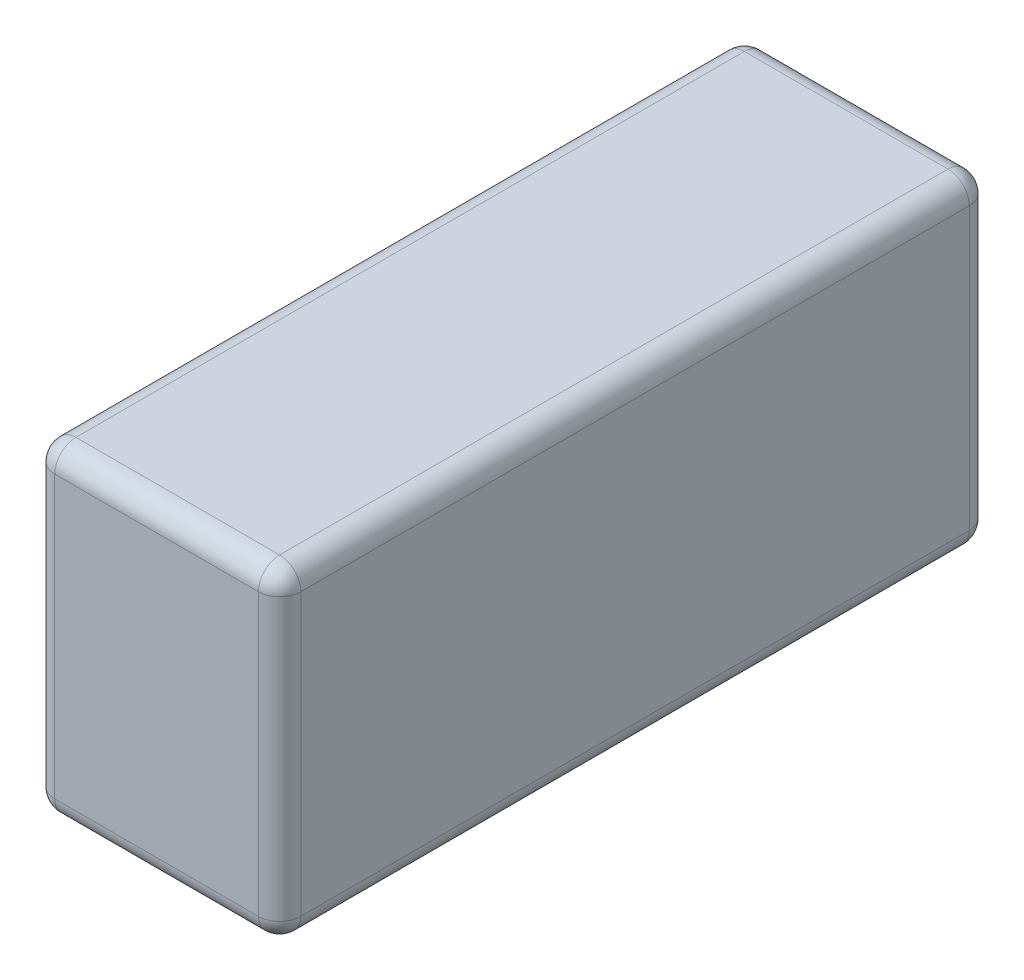
ISO-10303-21;
HEADER;
FILE_DESCRIPTION(('STEP AP214'),'2;1');
FILE_NAME('part.step','',(''),(''),'','','');
FILE_SCHEMA(('AUTOMOTIVE_DESIGN { 1 0 10303 214 1 1 1 1 }'));
ENDSEC;
DATA;
#1=APPLICATION_CONTEXT('core data for automotive mechanical design processes');
#2=APPLICATION_PROTOCOL_DEFINITION('international standard','automotive_design',2000,#1);
#3=PRODUCT_CONTEXT('',#1,'mechanical');
#4=PRODUCT('Part','Part','',(#3));
#5=PRODUCT_RELATED_PRODUCT_CATEGORY('part','',(#4));
#6=PRODUCT_DEFINITION_FORMATION('','',#4);
#7=PRODUCT_DEFINITION_CONTEXT('part definition',#1,'design');
#8=PRODUCT_DEFINITION('design','',#6,#7);
#9=PRODUCT_DEFINITION_SHAPE('','',#8);
#10=(LENGTH_UNIT() NAMED_UNIT(*) SI_UNIT(.MILLI.,.METRE.));
#11=(NAMED_UNIT(*) PLANE_ANGLE_UNIT() SI_UNIT($,.RADIAN.));
#12=(NAMED_UNIT(*) SI_UNIT($,.STERADIAN.) SOLID_ANGLE_UNIT());
#13=UNCERTAINTY_MEASURE_WITH_UNIT(LENGTH_MEASURE(1.E-05),#10,'distance_accuracy_value','');
#14=(GEOMETRIC_REPRESENTATION_CONTEXT(3) GLOBAL_UNCERTAINTY_ASSIGNED_CONTEXT((#13)) GLOBAL_UNIT_ASSIGNED_CONTEXT((#10,
#11,#12)) REPRESENTATION_CONTEXT('',''));
#15=CARTESIAN_POINT('',(0.,0.,0.));
#16=DIRECTION('',(0.,0.,1.));
#17=DIRECTION('',(1.,0.,0.));
#18=AXIS2_PLACEMENT_3D('',#15,#16,#17);
#19=CARTESIAN_POINT('',(11.6,30.5,-33.5));
#20=DIRECTION('',(-1.,0.,0.));
#21=DIRECTION('',(0.,0.,1.));
#22=AXIS2_PLACEMENT_3D('',#19,#20,#21);
#23=PLANE('',#22);
#24=DIRECTION('',(0.,-1.,0.));
#25=VECTOR('',#24,1.);
#26=CARTESIAN_POINT('',(11.6,30.5,-31.5));
#27=LINE('',#26,#25);
#28=CARTESIAN_POINT('',(11.6,2.,-31.5));
#29=VERTEX_POINT('',#28);
#30=CARTESIAN_POINT('',(11.6,28.5,-31.5));
#31=VERTEX_POINT('',#30);
#32=EDGE_CURVE('E218',#29,#31,#27,.F.);
#33=ORIENTED_EDGE('',*,*,#32,.T.);
#34=DIRECTION('',(0.,0.,-1.));
#35=VECTOR('',#34,1.);
#36=CARTESIAN_POINT('',(11.6,28.5,33.5));
#37=LINE('',#36,#35);
#38=CARTESIAN_POINT('',(11.6,28.5,31.5));
#39=VERTEX_POINT('',#38);
#40=EDGE_CURVE('E221',#31,#39,#37,.F.);
#41=ORIENTED_EDGE('',*,*,#40,.T.);
#42=DIRECTION('',(0.,-1.,0.));
#43=VECTOR('',#42,1.);
#44=CARTESIAN_POINT('',(11.6,30.5,31.5));
#45=LINE('',#44,#43);
#46=CARTESIAN_POINT('',(11.6,2.,31.5));
#47=VERTEX_POINT('',#46);
#48=EDGE_CURVE('E219',#39,#47,#45,.T.);
#49=ORIENTED_EDGE('',*,*,#48,.T.);
#50=DIRECTION('',(0.,0.,-1.));
#51=VECTOR('',#50,1.);
#52=CARTESIAN_POINT('',(11.6,2.,-33.5));
#53=LINE('',#52,#51);
#54=EDGE_CURVE('E215',#47,#29,#53,.T.);
#55=ORIENTED_EDGE('',*,*,#54,.T.);
#56=EDGE_LOOP('',(#33,#41,#49,#55));
#57=FACE_BOUND('',#56,.T.);
#58=ADVANCED_FACE('F36',(#57),#23,.F.);
#59=CARTESIAN_POINT('',(-11.6,30.5,-33.5));
#60=DIRECTION('',(0.,0.,1.));
#61=DIRECTION('',(1.,0.,0.));
#62=AXIS2_PLACEMENT_3D('',#59,#60,#61);
#63=PLANE('',#62);
#64=DIRECTION('',(-1.,0.,0.));
#65=VECTOR('',#64,1.);
#66=CARTESIAN_POINT('',(-11.6,2.,-33.5));
#67=LINE('',#66,#65);
#68=CARTESIAN_POINT('',(9.59999999999999,2.,-33.5));
#69=VERTEX_POINT('',#68);
#70=CARTESIAN_POINT('',(-9.6,2.,-33.5));
#71=VERTEX_POINT('',#70);
#72=EDGE_CURVE('E259',#69,#71,#67,.T.);
#73=ORIENTED_EDGE('',*,*,#72,.T.);
#74=DIRECTION('',(0.,-1.,0.));
#75=VECTOR('',#74,1.);
#76=CARTESIAN_POINT('',(-9.6,30.5,-33.5));
#77=LINE('',#76,#75);
#78=CARTESIAN_POINT('',(-9.6,28.5,-33.5));
#79=VERTEX_POINT('',#78);
#80=EDGE_CURVE('E265',#71,#79,#77,.F.);
#81=ORIENTED_EDGE('',*,*,#80,.T.);
#82=DIRECTION('',(-1.,0.,0.));
#83=VECTOR('',#82,1.);
#84=CARTESIAN_POINT('',(11.6,28.5,-33.5));
#85=LINE('',#84,#83);
#86=CARTESIAN_POINT('',(9.59999999999999,28.5,-33.5));
#87=VERTEX_POINT('',#86);
#88=EDGE_CURVE('E262',#79,#87,#85,.F.);
#89=ORIENTED_EDGE('',*,*,#88,.T.);
#90=DIRECTION('',(0.,-1.,0.));
#91=VECTOR('',#90,1.);
#92=CARTESIAN_POINT('',(9.59999999999999,30.5,-33.5));
#93=LINE('',#92,#91);
#94=EDGE_CURVE('E254',#87,#69,#93,.T.);
#95=ORIENTED_EDGE('',*,*,#94,.T.);
#96=EDGE_LOOP('',(#73,#81,#89,#95));
#97=FACE_BOUND('',#96,.T.);
#98=ADVANCED_FACE('F263',(#97),#63,.F.);
#99=CARTESIAN_POINT('',(-11.6,30.5,-33.5));
#100=DIRECTION('',(1.,0.,0.));
#101=DIRECTION('',(0.,0.,-1.));
#102=AXIS2_PLACEMENT_3D('',#99,#100,#101);
#103=PLANE('',#102);
#104=DIRECTION('',(0.,0.,1.));
#105=VECTOR('',#104,1.);
#106=CARTESIAN_POINT('',(-11.6,28.5,-33.5));
#107=LINE('',#106,#105);
#108=CARTESIAN_POINT('',(-11.6,28.5,31.5));
#109=VERTEX_POINT('',#108);
#110=CARTESIAN_POINT('',(-11.6,28.5,-31.5));
#111=VERTEX_POINT('',#110);
#112=EDGE_CURVE('E155',#109,#111,#107,.F.);
#113=ORIENTED_EDGE('',*,*,#112,.T.);
#114=DIRECTION('',(0.,-1.,0.));
#115=VECTOR('',#114,1.);
#116=CARTESIAN_POINT('',(-11.6,30.5,-31.5));
#117=LINE('',#116,#115);
#118=CARTESIAN_POINT('',(-11.6,2.,-31.5));
#119=VERTEX_POINT('',#118);
#120=EDGE_CURVE('E223',#111,#119,#117,.T.);
#121=ORIENTED_EDGE('',*,*,#120,.T.);
#122=DIRECTION('',(0.,0.,1.));
#123=VECTOR('',#122,1.);
#124=CARTESIAN_POINT('',(-11.6,2.,-33.5));
#125=LINE('',#124,#123);
#126=CARTESIAN_POINT('',(-11.6,2.,31.5));
#127=VERTEX_POINT('',#126);
#128=EDGE_CURVE('E282',#119,#127,#125,.T.);
#129=ORIENTED_EDGE('',*,*,#128,.T.);
#130=DIRECTION('',(0.,-1.,0.));
#131=VECTOR('',#130,1.);
#132=CARTESIAN_POINT('',(-11.6,30.5,31.5));
#133=LINE('',#132,#131);
#134=EDGE_CURVE('E280',#127,#109,#133,.F.);
#135=ORIENTED_EDGE('',*,*,#134,.T.);
#136=EDGE_LOOP('',(#113,#121,#129,#135));
#137=FACE_BOUND('',#136,.T.);
#138=ADVANCED_FACE('F287',(#137),#103,.F.);
#139=CARTESIAN_POINT('',(-11.6,30.5,33.5));
#140=DIRECTION('',(0.,0.,-1.));
#141=DIRECTION('',(-1.,0.,0.));
#142=AXIS2_PLACEMENT_3D('',#139,#140,#141);
#143=PLANE('',#142);
#144=DIRECTION('',(1.,0.,0.));
#145=VECTOR('',#144,1.);
#146=CARTESIAN_POINT('',(-11.6,28.5,33.5));
#147=LINE('',#146,#145);
#148=CARTESIAN_POINT('',(9.6,28.5,33.5));
#149=VERTEX_POINT('',#148);
#150=CARTESIAN_POINT('',(-9.6,28.5,33.5));
#151=VERTEX_POINT('',#150);
#152=EDGE_CURVE('E45',#149,#151,#147,.F.);
#153=ORIENTED_EDGE('',*,*,#152,.T.);
#154=DIRECTION('',(0.,-1.,0.));
#155=VECTOR('',#154,1.);
#156=CARTESIAN_POINT('',(-9.6,30.5,33.5));
#157=LINE('',#156,#155);
#158=CARTESIAN_POINT('',(-9.6,2.,33.5));
#159=VERTEX_POINT('',#158);
#160=EDGE_CURVE('E11',#151,#159,#157,.T.);
#161=ORIENTED_EDGE('',*,*,#160,.T.);
#162=DIRECTION('',(1.,0.,0.));
#163=VECTOR('',#162,1.);
#164=CARTESIAN_POINT('',(-11.6,2.,33.5));
#165=LINE('',#164,#163);
#166=CARTESIAN_POINT('',(9.6,2.,33.5));
#167=VERTEX_POINT('',#166);
#168=EDGE_CURVE('E229',#159,#167,#165,.T.);
#169=ORIENTED_EDGE('',*,*,#168,.T.);
#170=DIRECTION('',(0.,-1.,0.));
#171=VECTOR('',#170,1.);
#172=CARTESIAN_POINT('',(9.6,30.5,33.5));
#173=LINE('',#172,#171);
#174=EDGE_CURVE('E56',#167,#149,#173,.F.);
#175=ORIENTED_EDGE('',*,*,#174,.T.);
#176=EDGE_LOOP('',(#153,#161,#169,#175));
#177=FACE_BOUND('',#176,.T.);
#178=ADVANCED_FACE('F358',(#177),#143,.F.);
#179=CARTESIAN_POINT('',(0.,30.5,0.));
#180=DIRECTION('',(0.,1.,0.));
#181=DIRECTION('',(0.,0.,1.));
#182=AXIS2_PLACEMENT_3D('',#179,#180,#181);
#183=PLANE('',#182);
#184=DIRECTION('',(0.,0.,-1.));
#185=VECTOR('',#184,1.);
#186=CARTESIAN_POINT('',(9.6,30.5,-33.5));
#187=LINE('',#186,#185);
#188=CARTESIAN_POINT('',(9.6,30.5,31.5));
#189=VERTEX_POINT('',#188);
#190=CARTESIAN_POINT('',(9.6,30.5,-31.5));
#191=VERTEX_POINT('',#190);
#192=EDGE_CURVE('E134',#189,#191,#187,.T.);
#193=ORIENTED_EDGE('',*,*,#192,.T.);
#194=DIRECTION('',(-1.,0.,0.));
#195=VECTOR('',#194,1.);
#196=CARTESIAN_POINT('',(-11.6,30.5,-31.5));
#197=LINE('',#196,#195);
#198=CARTESIAN_POINT('',(-9.6,30.5,-31.5));
#199=VERTEX_POINT('',#198);
#200=EDGE_CURVE('E130',#191,#199,#197,.T.);
#201=ORIENTED_EDGE('',*,*,#200,.T.);
#202=DIRECTION('',(0.,0.,1.));
#203=VECTOR('',#202,1.);
#204=CARTESIAN_POINT('',(-9.6,30.5,33.5));
#205=LINE('',#204,#203);
#206=CARTESIAN_POINT('',(-9.6,30.5,31.5));
#207=VERTEX_POINT('',#206);
#208=EDGE_CURVE('E124',#199,#207,#205,.T.);
#209=ORIENTED_EDGE('',*,*,#208,.T.);
#210=DIRECTION('',(1.,0.,0.));
#211=VECTOR('',#210,1.);
#212=CARTESIAN_POINT('',(11.6,30.5,31.5));
#213=LINE('',#212,#211);
#214=EDGE_CURVE('E127',#207,#189,#213,.T.);
#215=ORIENTED_EDGE('',*,*,#214,.T.);
#216=EDGE_LOOP('',(#193,#201,#209,#215));
#217=FACE_BOUND('',#216,.T.);
#218=ADVANCED_FACE('F126',(#217),#183,.T.);
#219=CARTESIAN_POINT('',(0.,0.,0.));
#220=DIRECTION('',(0.,1.,0.));
#221=DIRECTION('',(0.,0.,1.));
#222=AXIS2_PLACEMENT_3D('',#219,#220,#221);
#223=PLANE('',#222);
#224=DIRECTION('',(0.,0.,1.));
#225=VECTOR('',#224,1.);
#226=CARTESIAN_POINT('',(-9.6,0.,0.));
#227=LINE('',#226,#225);
#228=CARTESIAN_POINT('',(-9.6,0.,31.5));
#229=VERTEX_POINT('',#228);
#230=CARTESIAN_POINT('',(-9.6,0.,-31.5));
#231=VERTEX_POINT('',#230);
#232=EDGE_CURVE('E276',#229,#231,#227,.F.);
#233=ORIENTED_EDGE('',*,*,#232,.T.);
#234=DIRECTION('',(-1.,0.,0.));
#235=VECTOR('',#234,1.);
#236=CARTESIAN_POINT('',(0.,0.,-31.5));
#237=LINE('',#236,#235);
#238=CARTESIAN_POINT('',(9.6,0.,-31.5));
#239=VERTEX_POINT('',#238);
#240=EDGE_CURVE('E278',#231,#239,#237,.F.);
#241=ORIENTED_EDGE('',*,*,#240,.T.);
#242=DIRECTION('',(0.,0.,-1.));
#243=VECTOR('',#242,1.);
#244=CARTESIAN_POINT('',(9.6,0.,0.));
#245=LINE('',#244,#243);
#246=CARTESIAN_POINT('',(9.6,0.,31.5));
#247=VERTEX_POINT('',#246);
#248=EDGE_CURVE('E213',#239,#247,#245,.F.);
#249=ORIENTED_EDGE('',*,*,#248,.T.);
#250=DIRECTION('',(1.,0.,0.));
#251=VECTOR('',#250,1.);
#252=CARTESIAN_POINT('',(0.,0.,31.5));
#253=LINE('',#252,#251);
#254=EDGE_CURVE('E270',#247,#229,#253,.F.);
#255=ORIENTED_EDGE('',*,*,#254,.T.);
#256=EDGE_LOOP('',(#233,#241,#249,#255));
#257=FACE_BOUND('',#256,.T.);
#258=ADVANCED_FACE('F359',(#257),#223,.F.);
#259=CARTESIAN_POINT('',(-11.6,2.,31.5));
#260=DIRECTION('',(1.,0.,0.));
#261=DIRECTION('',(0.,0.,-1.));
#262=AXIS2_PLACEMENT_3D('',#259,#260,#261);
#263=CYLINDRICAL_SURFACE('',#262,2.);
#264=CARTESIAN_POINT('',(9.6,2.,31.5));
#265=DIRECTION('',(1.,0.,0.));
#266=DIRECTION('',(0.,0.,-1.));
#267=AXIS2_PLACEMENT_3D('',#264,#265,#266);
#268=CIRCLE('',#267,2.);
#269=EDGE_CURVE('E40',#167,#247,#268,.T.);
#270=ORIENTED_EDGE('',*,*,#269,.F.);
#271=ORIENTED_EDGE('',*,*,#168,.F.);
#272=CARTESIAN_POINT('',(-9.6,2.,31.5));
#273=DIRECTION('',(-1.,0.,0.));
#274=DIRECTION('',(0.,0.,1.));
#275=AXIS2_PLACEMENT_3D('',#272,#273,#274);
#276=CIRCLE('',#275,2.);
#277=EDGE_CURVE('E193',#229,#159,#276,.T.);
#278=ORIENTED_EDGE('',*,*,#277,.F.);
#279=ORIENTED_EDGE('',*,*,#254,.F.);
#280=EDGE_LOOP('',(#270,#271,#278,#279));
#281=FACE_BOUND('',#280,.T.);
#282=ADVANCED_FACE('F38',(#281),#263,.T.);
#283=CARTESIAN_POINT('',(9.6,2.,31.5));
#284=DIRECTION('',(0.,0.,1.));
#285=DIRECTION('',(1.,0.,0.));
#286=AXIS2_PLACEMENT_3D('',#283,#284,#285);
#287=SPHERICAL_SURFACE('',#286,2.);
#288=CARTESIAN_POINT('',(9.6,2.,31.5));
#289=DIRECTION('',(0.,-1.,0.));
#290=DIRECTION('',(0.,0.,-1.));
#291=AXIS2_PLACEMENT_3D('',#288,#289,#290);
#292=CIRCLE('',#291,2.);
#293=EDGE_CURVE('E188',#167,#47,#292,.F.);
#294=ORIENTED_EDGE('',*,*,#293,.F.);
#295=ORIENTED_EDGE('',*,*,#269,.T.);
#296=CARTESIAN_POINT('',(9.6,2.,31.5));
#297=DIRECTION('',(0.,0.,1.));
#298=DIRECTION('',(1.,0.,0.));
#299=AXIS2_PLACEMENT_3D('',#296,#297,#298);
#300=CIRCLE('',#299,2.);
#301=EDGE_CURVE('E191',#47,#247,#300,.F.);
#302=ORIENTED_EDGE('',*,*,#301,.F.);
#303=EDGE_LOOP('',(#294,#295,#302));
#304=FACE_BOUND('',#303,.T.);
#305=ADVANCED_FACE('F205',(#304),#287,.T.);
#306=CARTESIAN_POINT('',(-9.6,2.,31.5));
#307=DIRECTION('',(0.,0.,1.));
#308=DIRECTION('',(1.,0.,0.));
#309=AXIS2_PLACEMENT_3D('',#306,#307,#308);
#310=SPHERICAL_SURFACE('',#309,2.);
#311=CARTESIAN_POINT('',(-9.6,2.,31.5));
#312=DIRECTION('',(0.,0.,1.));
#313=DIRECTION('',(1.,0.,0.));
#314=AXIS2_PLACEMENT_3D('',#311,#312,#313);
#315=CIRCLE('',#314,2.);
#316=EDGE_CURVE('E183',#229,#127,#315,.F.);
#317=ORIENTED_EDGE('',*,*,#316,.F.);
#318=ORIENTED_EDGE('',*,*,#277,.T.);
#319=CARTESIAN_POINT('',(-9.6,2.,31.5));
#320=DIRECTION('',(0.,-1.,0.));
#321=DIRECTION('',(0.,0.,-1.));
#322=AXIS2_PLACEMENT_3D('',#319,#320,#321);
#323=CIRCLE('',#322,2.);
#324=EDGE_CURVE('E186',#127,#159,#323,.F.);
#325=ORIENTED_EDGE('',*,*,#324,.F.);
#326=EDGE_LOOP('',(#317,#318,#325));
#327=FACE_BOUND('',#326,.T.);
#328=ADVANCED_FACE('F355',(#327),#310,.T.);
#329=CARTESIAN_POINT('',(9.6,2.,-33.5));
#330=DIRECTION('',(0.,0.,-1.));
#331=DIRECTION('',(-1.,0.,0.));
#332=AXIS2_PLACEMENT_3D('',#329,#330,#331);
#333=CYLINDRICAL_SURFACE('',#332,2.);
#334=ORIENTED_EDGE('',*,*,#301,.T.);
#335=ORIENTED_EDGE('',*,*,#248,.F.);
#336=CARTESIAN_POINT('',(9.6,2.,-31.5));
#337=DIRECTION('',(0.,0.,-1.));
#338=DIRECTION('',(-1.,0.,0.));
#339=AXIS2_PLACEMENT_3D('',#336,#337,#338);
#340=CIRCLE('',#339,2.);
#341=EDGE_CURVE('E178',#29,#239,#340,.T.);
#342=ORIENTED_EDGE('',*,*,#341,.F.);
#343=ORIENTED_EDGE('',*,*,#54,.F.);
#344=EDGE_LOOP('',(#334,#335,#342,#343));
#345=FACE_BOUND('',#344,.T.);
#346=ADVANCED_FACE('F211',(#345),#333,.T.);
#347=CARTESIAN_POINT('',(9.6,30.5,31.5));
#348=DIRECTION('',(0.,-1.,0.));
#349=DIRECTION('',(0.,0.,-1.));
#350=AXIS2_PLACEMENT_3D('',#347,#348,#349);
#351=CYLINDRICAL_SURFACE('',#350,2.);
#352=ORIENTED_EDGE('',*,*,#293,.T.);
#353=ORIENTED_EDGE('',*,*,#48,.F.);
#354=CARTESIAN_POINT('',(9.6,28.5,31.5));
#355=DIRECTION('',(0.,1.,0.));
#356=DIRECTION('',(0.,0.,1.));
#357=AXIS2_PLACEMENT_3D('',#354,#355,#356);
#358=CIRCLE('',#357,2.);
#359=EDGE_CURVE('E175',#149,#39,#358,.T.);
#360=ORIENTED_EDGE('',*,*,#359,.F.);
#361=ORIENTED_EDGE('',*,*,#174,.F.);
#362=EDGE_LOOP('',(#352,#353,#360,#361));
#363=FACE_BOUND('',#362,.T.);
#364=ADVANCED_FACE('F304',(#363),#351,.T.);
#365=CARTESIAN_POINT('',(0.,28.5,31.5));
#366=DIRECTION('',(-1.,0.,0.));
#367=DIRECTION('',(0.,0.,1.));
#368=AXIS2_PLACEMENT_3D('',#365,#366,#367);
#369=CYLINDRICAL_SURFACE('',#368,2.);
#370=CARTESIAN_POINT('',(-9.6,28.5,31.5));
#371=DIRECTION('',(-1.,0.,0.));
#372=DIRECTION('',(0.,0.,1.));
#373=AXIS2_PLACEMENT_3D('',#370,#371,#372);
#374=CIRCLE('',#373,2.);
#375=EDGE_CURVE('E140',#151,#207,#374,.T.);
#376=ORIENTED_EDGE('',*,*,#375,.F.);
#377=ORIENTED_EDGE('',*,*,#152,.F.);
#378=CARTESIAN_POINT('',(9.6,28.5,31.5));
#379=DIRECTION('',(1.,0.,0.));
#380=DIRECTION('',(0.,0.,-1.));
#381=AXIS2_PLACEMENT_3D('',#378,#379,#380);
#382=CIRCLE('',#381,2.);
#383=EDGE_CURVE('E143',#189,#149,#382,.T.);
#384=ORIENTED_EDGE('',*,*,#383,.F.);
#385=ORIENTED_EDGE('',*,*,#214,.F.);
#386=EDGE_LOOP('',(#376,#377,#384,#385));
#387=FACE_BOUND('',#386,.T.);
#388=ADVANCED_FACE('F139',(#387),#369,.T.);
#389=CARTESIAN_POINT('',(-9.6,30.5,31.5));
#390=DIRECTION('',(0.,-1.,0.));
#391=DIRECTION('',(0.,0.,-1.));
#392=AXIS2_PLACEMENT_3D('',#389,#390,#391);
#393=CYLINDRICAL_SURFACE('',#392,2.);
#394=ORIENTED_EDGE('',*,*,#324,.T.);
#395=ORIENTED_EDGE('',*,*,#160,.F.);
#396=CARTESIAN_POINT('',(-9.6,28.5,31.5));
#397=DIRECTION('',(0.,1.,0.));
#398=DIRECTION('',(0.,0.,1.));
#399=AXIS2_PLACEMENT_3D('',#396,#397,#398);
#400=CIRCLE('',#399,2.);
#401=EDGE_CURVE('E152',#109,#151,#400,.T.);
#402=ORIENTED_EDGE('',*,*,#401,.F.);
#403=ORIENTED_EDGE('',*,*,#134,.F.);
#404=EDGE_LOOP('',(#394,#395,#402,#403));
#405=FACE_BOUND('',#404,.T.);
#406=ADVANCED_FACE('F357',(#405),#393,.T.);
#407=CARTESIAN_POINT('',(-9.6,2.,-33.5));
#408=DIRECTION('',(0.,0.,1.));
#409=DIRECTION('',(1.,0.,0.));
#410=AXIS2_PLACEMENT_3D('',#407,#408,#409);
#411=CYLINDRICAL_SURFACE('',#410,2.);
#412=ORIENTED_EDGE('',*,*,#316,.T.);
#413=ORIENTED_EDGE('',*,*,#128,.F.);
#414=CARTESIAN_POINT('',(-9.6,2.,-31.5));
#415=DIRECTION('',(0.,0.,-1.));
#416=DIRECTION('',(-1.,0.,0.));
#417=AXIS2_PLACEMENT_3D('',#414,#415,#416);
#418=CIRCLE('',#417,2.);
#419=EDGE_CURVE('E170',#231,#119,#418,.T.);
#420=ORIENTED_EDGE('',*,*,#419,.F.);
#421=ORIENTED_EDGE('',*,*,#232,.F.);
#422=EDGE_LOOP('',(#412,#413,#420,#421));
#423=FACE_BOUND('',#422,.T.);
#424=ADVANCED_FACE('F353',(#423),#411,.T.);
#425=CARTESIAN_POINT('',(-11.6,2.,-31.5));
#426=DIRECTION('',(-1.,0.,0.));
#427=DIRECTION('',(0.,0.,1.));
#428=AXIS2_PLACEMENT_3D('',#425,#426,#427);
#429=CYLINDRICAL_SURFACE('',#428,2.);
#430=CARTESIAN_POINT('',(9.6,2.,-31.5));
#431=DIRECTION('',(1.,0.,0.));
#432=DIRECTION('',(0.,0.,-1.));
#433=AXIS2_PLACEMENT_3D('',#430,#431,#432);
#434=CIRCLE('',#433,2.);
#435=EDGE_CURVE('E180',#239,#69,#434,.T.);
#436=ORIENTED_EDGE('',*,*,#435,.F.);
#437=ORIENTED_EDGE('',*,*,#240,.F.);
#438=CARTESIAN_POINT('',(-9.6,2.,-31.5));
#439=DIRECTION('',(-1.,0.,0.));
#440=DIRECTION('',(0.,0.,1.));
#441=AXIS2_PLACEMENT_3D('',#438,#439,#440);
#442=CIRCLE('',#441,2.);
#443=EDGE_CURVE('E167',#71,#231,#442,.T.);
#444=ORIENTED_EDGE('',*,*,#443,.F.);
#445=ORIENTED_EDGE('',*,*,#72,.F.);
#446=EDGE_LOOP('',(#436,#437,#444,#445));
#447=FACE_BOUND('',#446,.T.);
#448=ADVANCED_FACE('F316',(#447),#429,.T.);
#449=CARTESIAN_POINT('',(9.6,2.,-31.5));
#450=DIRECTION('',(0.,0.,1.));
#451=DIRECTION('',(1.,0.,0.));
#452=AXIS2_PLACEMENT_3D('',#449,#450,#451);
#453=SPHERICAL_SURFACE('',#452,2.);
#454=ORIENTED_EDGE('',*,*,#341,.T.);
#455=ORIENTED_EDGE('',*,*,#435,.T.);
#456=CARTESIAN_POINT('',(9.59999999999999,2.,-31.5));
#457=DIRECTION('',(0.,-1.,0.));
#458=DIRECTION('',(0.,0.,-1.));
#459=AXIS2_PLACEMENT_3D('',#456,#457,#458);
#460=CIRCLE('',#459,2.);
#461=EDGE_CURVE('E159',#29,#69,#460,.F.);
#462=ORIENTED_EDGE('',*,*,#461,.F.);
#463=EDGE_LOOP('',(#454,#455,#462));
#464=FACE_BOUND('',#463,.T.);
#465=ADVANCED_FACE('F308',(#464),#453,.T.);
#466=CARTESIAN_POINT('',(9.6,28.5,31.5));
#467=DIRECTION('',(0.,0.,1.));
#468=DIRECTION('',(1.,0.,0.));
#469=AXIS2_PLACEMENT_3D('',#466,#467,#468);
#470=SPHERICAL_SURFACE('',#469,2.);
#471=ORIENTED_EDGE('',*,*,#383,.T.);
#472=ORIENTED_EDGE('',*,*,#359,.T.);
#473=CARTESIAN_POINT('',(9.6,28.5,31.5));
#474=DIRECTION('',(0.,0.,1.));
#475=DIRECTION('',(0.,-1.,0.));
#476=AXIS2_PLACEMENT_3D('',#473,#474,#475);
#477=CIRCLE('',#476,2.);
#478=EDGE_CURVE('E156',#189,#39,#477,.F.);
#479=ORIENTED_EDGE('',*,*,#478,.F.);
#480=EDGE_LOOP('',(#471,#472,#479));
#481=FACE_BOUND('',#480,.T.);
#482=ADVANCED_FACE('F306',(#481),#470,.T.);
#483=CARTESIAN_POINT('',(-9.6,28.5,31.5));
#484=DIRECTION('',(0.,0.,1.));
#485=DIRECTION('',(1.,0.,0.));
#486=AXIS2_PLACEMENT_3D('',#483,#484,#485);
#487=SPHERICAL_SURFACE('',#486,2.);
#488=ORIENTED_EDGE('',*,*,#401,.T.);
#489=ORIENTED_EDGE('',*,*,#375,.T.);
#490=CARTESIAN_POINT('',(-9.6,28.5,31.5));
#491=DIRECTION('',(0.,0.,1.));
#492=DIRECTION('',(1.,0.,0.));
#493=AXIS2_PLACEMENT_3D('',#490,#491,#492);
#494=CIRCLE('',#493,2.);
#495=EDGE_CURVE('E149',#109,#207,#494,.F.);
#496=ORIENTED_EDGE('',*,*,#495,.F.);
#497=EDGE_LOOP('',(#488,#489,#496));
#498=FACE_BOUND('',#497,.T.);
#499=ADVANCED_FACE('F148',(#498),#487,.T.);
#500=CARTESIAN_POINT('',(-9.6,2.,-31.5));
#501=DIRECTION('',(0.,0.,1.));
#502=DIRECTION('',(1.,0.,0.));
#503=AXIS2_PLACEMENT_3D('',#500,#501,#502);
#504=SPHERICAL_SURFACE('',#503,2.);
#505=ORIENTED_EDGE('',*,*,#443,.T.);
#506=ORIENTED_EDGE('',*,*,#419,.T.);
#507=CARTESIAN_POINT('',(-9.6,2.,-31.5));
#508=DIRECTION('',(0.,-1.,0.));
#509=DIRECTION('',(0.,0.,-1.));
#510=AXIS2_PLACEMENT_3D('',#507,#508,#509);
#511=CIRCLE('',#510,2.);
#512=EDGE_CURVE('E157',#71,#119,#511,.F.);
#513=ORIENTED_EDGE('',*,*,#512,.F.);
#514=EDGE_LOOP('',(#505,#506,#513));
#515=FACE_BOUND('',#514,.T.);
#516=ADVANCED_FACE('F314',(#515),#504,.T.);
#517=CARTESIAN_POINT('',(9.59999999999999,30.5,-31.5));
#518=DIRECTION('',(0.,-1.,0.));
#519=DIRECTION('',(0.,0.,-1.));
#520=AXIS2_PLACEMENT_3D('',#517,#518,#519);
#521=CYLINDRICAL_SURFACE('',#520,2.);
#522=ORIENTED_EDGE('',*,*,#461,.T.);
#523=ORIENTED_EDGE('',*,*,#94,.F.);
#524=CARTESIAN_POINT('',(9.6,28.5,-31.5));
#525=DIRECTION('',(0.,1.,0.));
#526=DIRECTION('',(0.,0.,1.));
#527=AXIS2_PLACEMENT_3D('',#524,#525,#526);
#528=CIRCLE('',#527,2.);
#529=EDGE_CURVE('E161',#31,#87,#528,.T.);
#530=ORIENTED_EDGE('',*,*,#529,.F.);
#531=ORIENTED_EDGE('',*,*,#32,.F.);
#532=EDGE_LOOP('',(#522,#523,#530,#531));
#533=FACE_BOUND('',#532,.T.);
#534=ADVANCED_FACE('F256',(#533),#521,.T.);
#535=CARTESIAN_POINT('',(9.6,28.5,0.));
#536=DIRECTION('',(0.,0.,1.));
#537=DIRECTION('',(1.,0.,0.));
#538=AXIS2_PLACEMENT_3D('',#535,#536,#537);
#539=CYLINDRICAL_SURFACE('',#538,2.);
#540=ORIENTED_EDGE('',*,*,#478,.T.);
#541=ORIENTED_EDGE('',*,*,#40,.F.);
#542=CARTESIAN_POINT('',(9.6,28.5,-31.5));
#543=DIRECTION('',(0.,0.,-1.));
#544=DIRECTION('',(-1.,0.,0.));
#545=AXIS2_PLACEMENT_3D('',#542,#543,#544);
#546=CIRCLE('',#545,2.);
#547=EDGE_CURVE('E243',#191,#31,#546,.T.);
#548=ORIENTED_EDGE('',*,*,#547,.F.);
#549=ORIENTED_EDGE('',*,*,#192,.F.);
#550=EDGE_LOOP('',(#540,#541,#548,#549));
#551=FACE_BOUND('',#550,.T.);
#552=ADVANCED_FACE('F300',(#551),#539,.T.);
#553=CARTESIAN_POINT('',(-9.6,28.5,0.));
#554=DIRECTION('',(0.,0.,-1.));
#555=DIRECTION('',(-1.,0.,0.));
#556=AXIS2_PLACEMENT_3D('',#553,#554,#555);
#557=CYLINDRICAL_SURFACE('',#556,2.);
#558=ORIENTED_EDGE('',*,*,#495,.T.);
#559=ORIENTED_EDGE('',*,*,#208,.F.);
#560=CARTESIAN_POINT('',(-9.6,28.5,-31.5));
#561=DIRECTION('',(0.,0.,-1.));
#562=DIRECTION('',(-1.,0.,0.));
#563=AXIS2_PLACEMENT_3D('',#560,#561,#562);
#564=CIRCLE('',#563,2.);
#565=EDGE_CURVE('E240',#111,#199,#564,.T.);
#566=ORIENTED_EDGE('',*,*,#565,.F.);
#567=ORIENTED_EDGE('',*,*,#112,.F.);
#568=EDGE_LOOP('',(#558,#559,#566,#567));
#569=FACE_BOUND('',#568,.T.);
#570=ADVANCED_FACE('F154',(#569),#557,.T.);
#571=CARTESIAN_POINT('',(-9.6,30.5,-31.5));
#572=DIRECTION('',(0.,-1.,0.));
#573=DIRECTION('',(0.,0.,-1.));
#574=AXIS2_PLACEMENT_3D('',#571,#572,#573);
#575=CYLINDRICAL_SURFACE('',#574,2.);
#576=ORIENTED_EDGE('',*,*,#512,.T.);
#577=ORIENTED_EDGE('',*,*,#120,.F.);
#578=CARTESIAN_POINT('',(-9.6,28.5,-31.5));
#579=DIRECTION('',(0.,1.,0.));
#580=DIRECTION('',(0.,0.,1.));
#581=AXIS2_PLACEMENT_3D('',#578,#579,#580);
#582=CIRCLE('',#581,2.);
#583=EDGE_CURVE('E237',#79,#111,#582,.T.);
#584=ORIENTED_EDGE('',*,*,#583,.F.);
#585=ORIENTED_EDGE('',*,*,#80,.F.);
#586=EDGE_LOOP('',(#576,#577,#584,#585));
#587=FACE_BOUND('',#586,.T.);
#588=ADVANCED_FACE('F290',(#587),#575,.T.);
#589=CARTESIAN_POINT('',(9.6,28.5,-31.5));
#590=DIRECTION('',(0.,0.,1.));
#591=DIRECTION('',(1.,0.,0.));
#592=AXIS2_PLACEMENT_3D('',#589,#590,#591);
#593=SPHERICAL_SURFACE('',#592,2.);
#594=ORIENTED_EDGE('',*,*,#547,.T.);
#595=ORIENTED_EDGE('',*,*,#529,.T.);
#596=CARTESIAN_POINT('',(9.59999999999999,28.5,-31.5));
#597=DIRECTION('',(1.,0.,0.));
#598=DIRECTION('',(0.,1.,0.));
#599=AXIS2_PLACEMENT_3D('',#596,#597,#598);
#600=CIRCLE('',#599,2.);
#601=EDGE_CURVE('E235',#191,#87,#600,.F.);
#602=ORIENTED_EDGE('',*,*,#601,.F.);
#603=EDGE_LOOP('',(#594,#595,#602));
#604=FACE_BOUND('',#603,.T.);
#605=ADVANCED_FACE('F250',(#604),#593,.T.);
#606=CARTESIAN_POINT('',(-9.6,28.5,-31.5));
#607=DIRECTION('',(0.,0.,1.));
#608=DIRECTION('',(1.,0.,0.));
#609=AXIS2_PLACEMENT_3D('',#606,#607,#608);
#610=SPHERICAL_SURFACE('',#609,2.);
#611=ORIENTED_EDGE('',*,*,#583,.T.);
#612=ORIENTED_EDGE('',*,*,#565,.T.);
#613=CARTESIAN_POINT('',(-9.6,28.5,-31.5));
#614=DIRECTION('',(-1.,0.,0.));
#615=DIRECTION('',(0.,0.,1.));
#616=AXIS2_PLACEMENT_3D('',#613,#614,#615);
#617=CIRCLE('',#616,2.);
#618=EDGE_CURVE('E233',#79,#199,#617,.F.);
#619=ORIENTED_EDGE('',*,*,#618,.F.);
#620=EDGE_LOOP('',(#611,#612,#619));
#621=FACE_BOUND('',#620,.T.);
#622=ADVANCED_FACE('F293',(#621),#610,.T.);
#623=CARTESIAN_POINT('',(0.,28.5,-31.5));
#624=DIRECTION('',(1.,0.,0.));
#625=DIRECTION('',(0.,0.,-1.));
#626=AXIS2_PLACEMENT_3D('',#623,#624,#625);
#627=CYLINDRICAL_SURFACE('',#626,2.);
#628=ORIENTED_EDGE('',*,*,#601,.T.);
#629=ORIENTED_EDGE('',*,*,#88,.F.);
#630=ORIENTED_EDGE('',*,*,#618,.T.);
#631=ORIENTED_EDGE('',*,*,#200,.F.);
#632=EDGE_LOOP('',(#628,#629,#630,#631));
#633=FACE_BOUND('',#632,.T.);
#634=ADVANCED_FACE('F294',(#633),#627,.T.);
#635=CLOSED_SHELL('',(#58,#98,#138,#178,#218,#258,#282,#305,#328,#346,#364,#388,#406,#424,#448,
#465,#482,#499,#516,#534,#552,#570,#588,#605,#622,#634));
#636=MANIFOLD_SOLID_BREP('B2',#635);
#637=ADVANCED_BREP_SHAPE_REPRESENTATION('',(#18,#636),#14);
#638=SHAPE_DEFINITION_REPRESENTATION(#9,#637);
ENDSEC;
END-ISO-10303-21;
